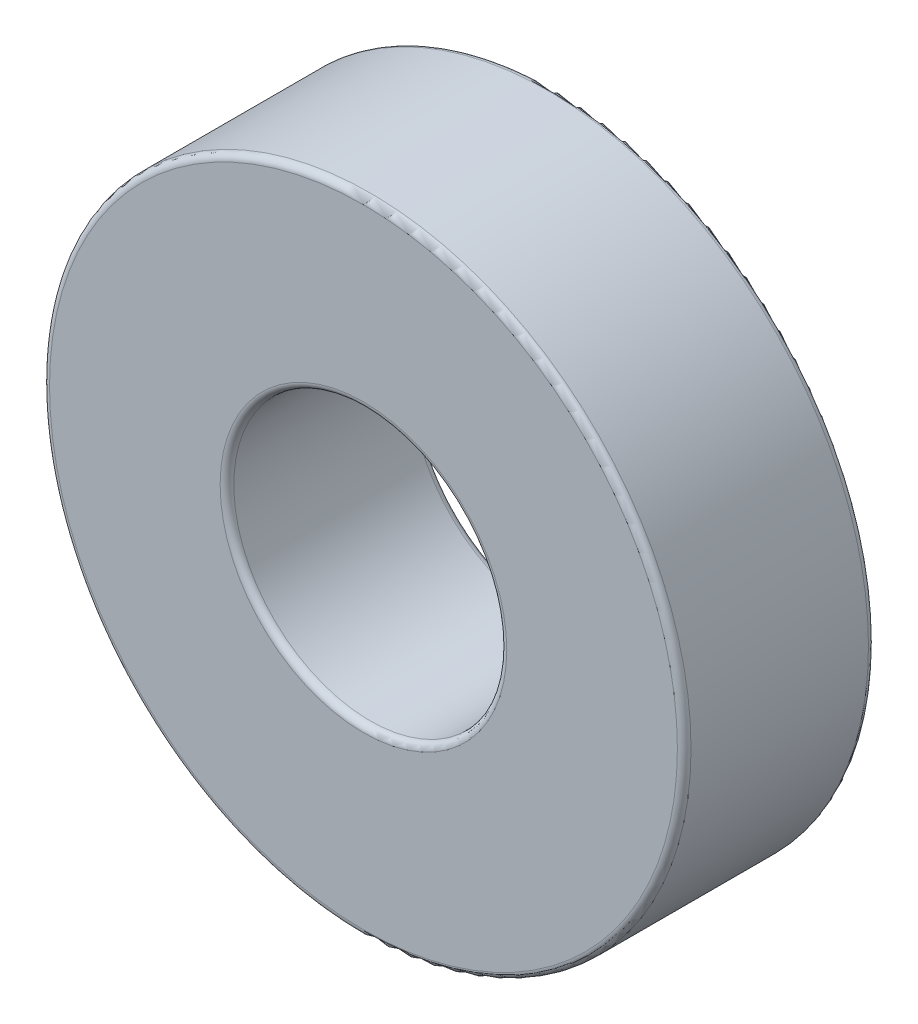
ISO-10303-21;
HEADER;
FILE_DESCRIPTION(('STEP AP214'),'2;1');
FILE_NAME('part.step','',(''),(''),'','','');
FILE_SCHEMA(('AUTOMOTIVE_DESIGN { 1 0 10303 214 1 1 1 1 }'));
ENDSEC;
DATA;
#1=APPLICATION_CONTEXT('core data for automotive mechanical design processes');
#2=APPLICATION_PROTOCOL_DEFINITION('international standard','automotive_design',2000,#1);
#3=PRODUCT_CONTEXT('',#1,'mechanical');
#4=PRODUCT('Part','Part','',(#3));
#5=PRODUCT_RELATED_PRODUCT_CATEGORY('part','',(#4));
#6=PRODUCT_DEFINITION_FORMATION('','',#4);
#7=PRODUCT_DEFINITION_CONTEXT('part definition',#1,'design');
#8=PRODUCT_DEFINITION('design','',#6,#7);
#9=PRODUCT_DEFINITION_SHAPE('','',#8);
#10=(LENGTH_UNIT() NAMED_UNIT(*) SI_UNIT(.MILLI.,.METRE.));
#11=(NAMED_UNIT(*) PLANE_ANGLE_UNIT() SI_UNIT($,.RADIAN.));
#12=(NAMED_UNIT(*) SI_UNIT($,.STERADIAN.) SOLID_ANGLE_UNIT());
#13=UNCERTAINTY_MEASURE_WITH_UNIT(LENGTH_MEASURE(1.E-05),#10,'distance_accuracy_value','');
#14=(GEOMETRIC_REPRESENTATION_CONTEXT(3) GLOBAL_UNCERTAINTY_ASSIGNED_CONTEXT((#13)) GLOBAL_UNIT_ASSIGNED_CONTEXT((#10,
#11,#12)) REPRESENTATION_CONTEXT('',''));
#15=CARTESIAN_POINT('',(0.,0.,0.));
#16=DIRECTION('',(0.,0.,1.));
#17=DIRECTION('',(1.,0.,0.));
#18=AXIS2_PLACEMENT_3D('',#15,#16,#17);
#19=CARTESIAN_POINT('',(0.,0.,14.));
#20=DIRECTION('',(0.,0.,1.));
#21=DIRECTION('',(1.,0.,0.));
#22=AXIS2_PLACEMENT_3D('',#19,#20,#21);
#23=PLANE('',#22);
#24=CARTESIAN_POINT('',(0.,0.,14.));
#25=DIRECTION('',(0.,0.,1.));
#26=DIRECTION('',(1.,0.,0.));
#27=AXIS2_PLACEMENT_3D('',#24,#25,#26);
#28=CIRCLE('',#27,23.);
#29=CARTESIAN_POINT('',(23.,0.,14.));
#30=VERTEX_POINT('',#29);
#31=EDGE_CURVE('E39',#30,#30,#28,.T.);
#32=ORIENTED_EDGE('',*,*,#31,.T.);
#33=EDGE_LOOP('',(#32));
#34=FACE_BOUND('',#33,.T.);
#35=CARTESIAN_POINT('',(0.,0.,14.));
#36=DIRECTION('',(0.,0.,1.));
#37=DIRECTION('',(1.,0.,0.));
#38=AXIS2_PLACEMENT_3D('',#35,#36,#37);
#39=CIRCLE('',#38,10.5);
#40=CARTESIAN_POINT('',(10.5,0.,14.));
#41=VERTEX_POINT('',#40);
#42=EDGE_CURVE('E43',#41,#41,#39,.F.);
#43=ORIENTED_EDGE('',*,*,#42,.T.);
#44=EDGE_LOOP('',(#43));
#45=FACE_BOUND('',#44,.T.);
#46=ADVANCED_FACE('F28',(#34,#45),#23,.T.);
#47=CARTESIAN_POINT('',(0.,0.,0.));
#48=DIRECTION('',(0.,0.,1.));
#49=DIRECTION('',(1.,0.,0.));
#50=AXIS2_PLACEMENT_3D('',#47,#48,#49);
#51=PLANE('',#50);
#52=CARTESIAN_POINT('',(0.,0.,0.));
#53=DIRECTION('',(0.,0.,1.));
#54=DIRECTION('',(1.,0.,0.));
#55=AXIS2_PLACEMENT_3D('',#52,#53,#54);
#56=CIRCLE('',#55,23.);
#57=CARTESIAN_POINT('',(23.,0.,0.));
#58=VERTEX_POINT('',#57);
#59=EDGE_CURVE('E48',#58,#58,#56,.F.);
#60=ORIENTED_EDGE('',*,*,#59,.T.);
#61=EDGE_LOOP('',(#60));
#62=FACE_BOUND('',#61,.T.);
#63=CARTESIAN_POINT('',(0.,0.,0.));
#64=DIRECTION('',(0.,0.,1.));
#65=DIRECTION('',(1.,0.,0.));
#66=AXIS2_PLACEMENT_3D('',#63,#64,#65);
#67=CIRCLE('',#66,10.5);
#68=CARTESIAN_POINT('',(10.5,0.,0.));
#69=VERTEX_POINT('',#68);
#70=EDGE_CURVE('E51',#69,#69,#67,.T.);
#71=ORIENTED_EDGE('',*,*,#70,.T.);
#72=EDGE_LOOP('',(#71));
#73=FACE_BOUND('',#72,.T.);
#74=ADVANCED_FACE('F73',(#62,#73),#51,.F.);
#75=CARTESIAN_POINT('',(0.,0.,14.));
#76=DIRECTION('',(0.,0.,-1.));
#77=DIRECTION('',(-1.,0.,0.));
#78=AXIS2_PLACEMENT_3D('',#75,#76,#77);
#79=CYLINDRICAL_SURFACE('',#78,23.5);
#80=CARTESIAN_POINT('',(0.,0.,0.5));
#81=DIRECTION('',(0.,0.,1.));
#82=DIRECTION('',(1.,0.,0.));
#83=AXIS2_PLACEMENT_3D('',#80,#81,#82);
#84=CIRCLE('',#83,23.5);
#85=CARTESIAN_POINT('',(23.5,0.,0.5));
#86=VERTEX_POINT('',#85);
#87=EDGE_CURVE('E54',#86,#86,#84,.T.);
#88=ORIENTED_EDGE('',*,*,#87,.T.);
#89=EDGE_LOOP('',(#88));
#90=FACE_BOUND('',#89,.T.);
#91=CARTESIAN_POINT('',(0.,0.,13.5));
#92=DIRECTION('',(0.,0.,1.));
#93=DIRECTION('',(1.,0.,0.));
#94=AXIS2_PLACEMENT_3D('',#91,#92,#93);
#95=CIRCLE('',#94,23.5);
#96=CARTESIAN_POINT('',(23.5,0.,13.5));
#97=VERTEX_POINT('',#96);
#98=EDGE_CURVE('E57',#97,#97,#95,.F.);
#99=ORIENTED_EDGE('',*,*,#98,.T.);
#100=EDGE_LOOP('',(#99));
#101=FACE_BOUND('',#100,.T.);
#102=ADVANCED_FACE('F61',(#90,#101),#79,.T.);
#103=CARTESIAN_POINT('',(0.,0.,14.));
#104=DIRECTION('',(0.,0.,-1.));
#105=DIRECTION('',(-1.,0.,0.));
#106=AXIS2_PLACEMENT_3D('',#103,#104,#105);
#107=CYLINDRICAL_SURFACE('',#106,10.);
#108=CARTESIAN_POINT('',(0.,0.,0.5));
#109=DIRECTION('',(0.,0.,1.));
#110=DIRECTION('',(1.,0.,0.));
#111=AXIS2_PLACEMENT_3D('',#108,#109,#110);
#112=CIRCLE('',#111,10.);
#113=CARTESIAN_POINT('',(10.,0.,0.5));
#114=VERTEX_POINT('',#113);
#115=EDGE_CURVE('E10',#114,#114,#112,.F.);
#116=ORIENTED_EDGE('',*,*,#115,.T.);
#117=EDGE_LOOP('',(#116));
#118=FACE_BOUND('',#117,.T.);
#119=CARTESIAN_POINT('',(0.,0.,13.5));
#120=DIRECTION('',(0.,0.,1.));
#121=DIRECTION('',(1.,0.,0.));
#122=AXIS2_PLACEMENT_3D('',#119,#120,#121);
#123=CIRCLE('',#122,10.);
#124=CARTESIAN_POINT('',(10.,0.,13.5));
#125=VERTEX_POINT('',#124);
#126=EDGE_CURVE('E35',#125,#125,#123,.T.);
#127=ORIENTED_EDGE('',*,*,#126,.T.);
#128=EDGE_LOOP('',(#127));
#129=FACE_BOUND('',#128,.T.);
#130=ADVANCED_FACE('F89',(#118,#129),#107,.F.);
#131=CARTESIAN_POINT('',(0.,0.,0.5));
#132=DIRECTION('',(0.,0.,1.));
#133=DIRECTION('',(1.,0.,0.));
#134=AXIS2_PLACEMENT_3D('',#131,#132,#133);
#135=TOROIDAL_SURFACE('',#134,23.,0.5);
#136=ORIENTED_EDGE('',*,*,#59,.F.);
#137=EDGE_LOOP('',(#136));
#138=FACE_BOUND('',#137,.T.);
#139=ORIENTED_EDGE('',*,*,#87,.F.);
#140=EDGE_LOOP('',(#139));
#141=FACE_BOUND('',#140,.T.);
#142=ADVANCED_FACE('F67',(#138,#141),#135,.T.);
#143=CARTESIAN_POINT('',(0.,0.,13.5));
#144=DIRECTION('',(0.,0.,1.));
#145=DIRECTION('',(1.,0.,0.));
#146=AXIS2_PLACEMENT_3D('',#143,#144,#145);
#147=TOROIDAL_SURFACE('',#146,23.,0.5);
#148=ORIENTED_EDGE('',*,*,#98,.F.);
#149=EDGE_LOOP('',(#148));
#150=FACE_BOUND('',#149,.T.);
#151=ORIENTED_EDGE('',*,*,#31,.F.);
#152=EDGE_LOOP('',(#151));
#153=FACE_BOUND('',#152,.T.);
#154=ADVANCED_FACE('F63',(#150,#153),#147,.T.);
#155=CARTESIAN_POINT('',(0.,0.,0.5));
#156=DIRECTION('',(0.,0.,1.));
#157=DIRECTION('',(1.,0.,0.));
#158=AXIS2_PLACEMENT_3D('',#155,#156,#157);
#159=TOROIDAL_SURFACE('',#158,10.5,0.5);
#160=ORIENTED_EDGE('',*,*,#115,.F.);
#161=EDGE_LOOP('',(#160));
#162=FACE_BOUND('',#161,.T.);
#163=ORIENTED_EDGE('',*,*,#70,.F.);
#164=EDGE_LOOP('',(#163));
#165=FACE_BOUND('',#164,.T.);
#166=ADVANCED_FACE('F66',(#162,#165),#159,.T.);
#167=CARTESIAN_POINT('',(0.,0.,13.5));
#168=DIRECTION('',(0.,0.,1.));
#169=DIRECTION('',(1.,0.,0.));
#170=AXIS2_PLACEMENT_3D('',#167,#168,#169);
#171=TOROIDAL_SURFACE('',#170,10.5,0.5);
#172=ORIENTED_EDGE('',*,*,#42,.F.);
#173=EDGE_LOOP('',(#172));
#174=FACE_BOUND('',#173,.T.);
#175=ORIENTED_EDGE('',*,*,#126,.F.);
#176=EDGE_LOOP('',(#175));
#177=FACE_BOUND('',#176,.T.);
#178=ADVANCED_FACE('F30',(#174,#177),#171,.T.);
#179=CLOSED_SHELL('',(#46,#74,#102,#130,#142,#154,#166,#178));
#180=MANIFOLD_SOLID_BREP('B2',#179);
#181=ADVANCED_BREP_SHAPE_REPRESENTATION('',(#18,#180),#14);
#182=SHAPE_DEFINITION_REPRESENTATION(#9,#181);
ENDSEC;
END-ISO-10303-21;
